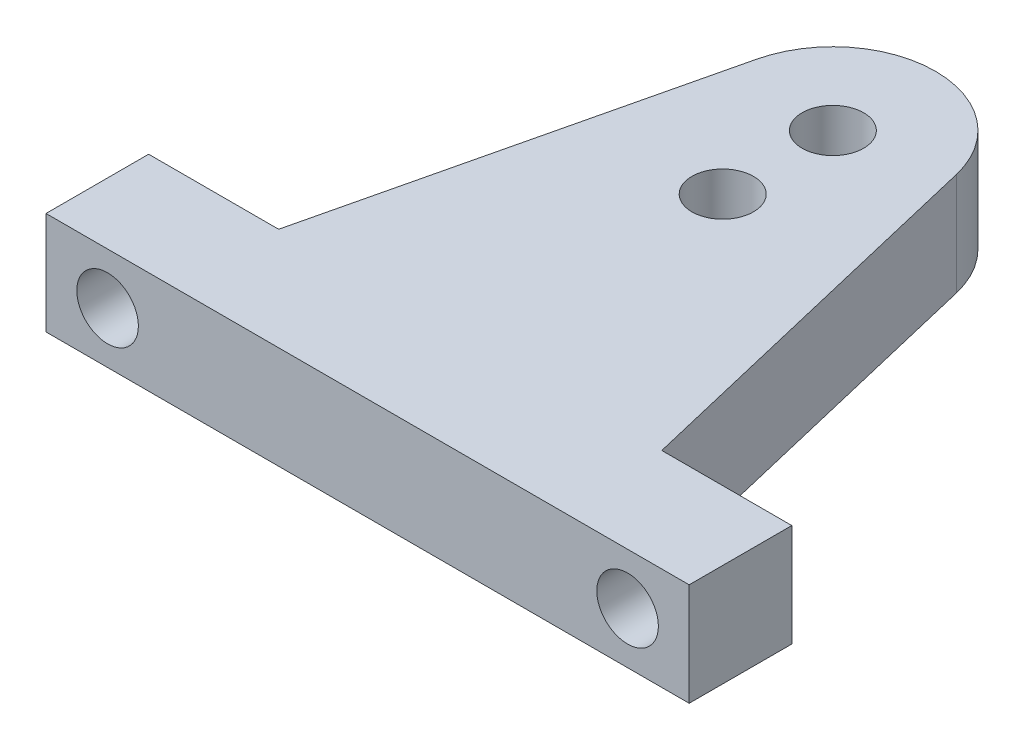
ISO-10303-21;
HEADER;
FILE_DESCRIPTION(('STEP AP214'),'2;1');
FILE_NAME('part.step','',(''),(''),'','','');
FILE_SCHEMA(('AUTOMOTIVE_DESIGN { 1 0 10303 214 1 1 1 1 }'));
ENDSEC;
DATA;
#1=APPLICATION_CONTEXT('core data for automotive mechanical design processes');
#2=APPLICATION_PROTOCOL_DEFINITION('international standard','automotive_design',2000,#1);
#3=PRODUCT_CONTEXT('',#1,'mechanical');
#4=PRODUCT('Part','Part','',(#3));
#5=PRODUCT_RELATED_PRODUCT_CATEGORY('part','',(#4));
#6=PRODUCT_DEFINITION_FORMATION('','',#4);
#7=PRODUCT_DEFINITION_CONTEXT('part definition',#1,'design');
#8=PRODUCT_DEFINITION('design','',#6,#7);
#9=PRODUCT_DEFINITION_SHAPE('','',#8);
#10=(LENGTH_UNIT() NAMED_UNIT(*) SI_UNIT(.MILLI.,.METRE.));
#11=(NAMED_UNIT(*) PLANE_ANGLE_UNIT() SI_UNIT($,.RADIAN.));
#12=(NAMED_UNIT(*) SI_UNIT($,.STERADIAN.) SOLID_ANGLE_UNIT());
#13=UNCERTAINTY_MEASURE_WITH_UNIT(LENGTH_MEASURE(1.E-05),#10,'distance_accuracy_value','');
#14=(GEOMETRIC_REPRESENTATION_CONTEXT(3) GLOBAL_UNCERTAINTY_ASSIGNED_CONTEXT((#13)) GLOBAL_UNIT_ASSIGNED_CONTEXT((#10,
#11,#12)) REPRESENTATION_CONTEXT('',''));
#15=CARTESIAN_POINT('',(0.,0.,0.));
#16=DIRECTION('',(0.,0.,1.));
#17=DIRECTION('',(1.,0.,0.));
#18=AXIS2_PLACEMENT_3D('',#15,#16,#17);
#19=CARTESIAN_POINT('',(47.,15.,0.));
#20=DIRECTION('',(-1.,0.,0.));
#21=DIRECTION('',(0.,0.,1.));
#22=AXIS2_PLACEMENT_3D('',#19,#20,#21);
#23=PLANE('',#22);
#24=DIRECTION('',(0.,0.,-1.));
#25=VECTOR('',#24,1.);
#26=CARTESIAN_POINT('',(47.,0.,0.));
#27=LINE('',#26,#25);
#28=CARTESIAN_POINT('',(47.,0.,0.));
#29=VERTEX_POINT('',#28);
#30=CARTESIAN_POINT('',(47.,0.,-15.));
#31=VERTEX_POINT('',#30);
#32=EDGE_CURVE('E129',#29,#31,#27,.T.);
#33=ORIENTED_EDGE('',*,*,#32,.T.);
#34=DIRECTION('',(0.,-1.,0.));
#35=VECTOR('',#34,1.);
#36=CARTESIAN_POINT('',(47.,15.,-15.));
#37=LINE('',#36,#35);
#38=CARTESIAN_POINT('',(47.,15.,-15.));
#39=VERTEX_POINT('',#38);
#40=EDGE_CURVE('E11',#39,#31,#37,.T.);
#41=ORIENTED_EDGE('',*,*,#40,.F.);
#42=DIRECTION('',(0.,0.,-1.));
#43=VECTOR('',#42,1.);
#44=CARTESIAN_POINT('',(47.,15.,0.));
#45=LINE('',#44,#43);
#46=CARTESIAN_POINT('',(47.,15.,0.));
#47=VERTEX_POINT('',#46);
#48=EDGE_CURVE('E144',#47,#39,#45,.T.);
#49=ORIENTED_EDGE('',*,*,#48,.F.);
#50=DIRECTION('',(0.,-1.,0.));
#51=VECTOR('',#50,1.);
#52=CARTESIAN_POINT('',(47.,15.,0.));
#53=LINE('',#52,#51);
#54=EDGE_CURVE('E125',#47,#29,#53,.T.);
#55=ORIENTED_EDGE('',*,*,#54,.T.);
#56=EDGE_LOOP('',(#33,#41,#49,#55));
#57=FACE_BOUND('',#56,.T.);
#58=ADVANCED_FACE('F33',(#57),#23,.F.);
#59=CARTESIAN_POINT('',(47.,15.,-15.));
#60=DIRECTION('',(0.,0.,1.));
#61=DIRECTION('',(1.,0.,0.));
#62=AXIS2_PLACEMENT_3D('',#59,#60,#61);
#63=PLANE('',#62);
#64=CARTESIAN_POINT('',(38.,7.5,-15.));
#65=DIRECTION('',(0.,0.,1.));
#66=DIRECTION('',(1.,0.,0.));
#67=AXIS2_PLACEMENT_3D('',#64,#65,#66);
#68=CIRCLE('',#67,4.5);
#69=CARTESIAN_POINT('',(42.5,7.5,-15.));
#70=VERTEX_POINT('',#69);
#71=EDGE_CURVE('E182',#70,#70,#68,.F.);
#72=ORIENTED_EDGE('',*,*,#71,.F.);
#73=EDGE_LOOP('',(#72));
#74=FACE_BOUND('',#73,.T.);
#75=DIRECTION('',(-1.,0.,0.));
#76=VECTOR('',#75,1.);
#77=CARTESIAN_POINT('',(47.,0.,-15.));
#78=LINE('',#77,#76);
#79=CARTESIAN_POINT('',(28.,0.,-15.));
#80=VERTEX_POINT('',#79);
#81=EDGE_CURVE('E132',#31,#80,#78,.T.);
#82=ORIENTED_EDGE('',*,*,#81,.T.);
#83=DIRECTION('',(0.,-1.,0.));
#84=VECTOR('',#83,1.);
#85=CARTESIAN_POINT('',(28.,15.,-15.));
#86=LINE('',#85,#84);
#87=CARTESIAN_POINT('',(28.,15.,-15.));
#88=VERTEX_POINT('',#87);
#89=EDGE_CURVE('E41',#88,#80,#86,.T.);
#90=ORIENTED_EDGE('',*,*,#89,.F.);
#91=DIRECTION('',(-1.,0.,0.));
#92=VECTOR('',#91,1.);
#93=CARTESIAN_POINT('',(47.,15.,-15.));
#94=LINE('',#93,#92);
#95=EDGE_CURVE('E92',#39,#88,#94,.T.);
#96=ORIENTED_EDGE('',*,*,#95,.F.);
#97=ORIENTED_EDGE('',*,*,#40,.T.);
#98=EDGE_LOOP('',(#82,#90,#96,#97));
#99=FACE_BOUND('',#98,.T.);
#100=ADVANCED_FACE('F229',(#74,#99),#63,.F.);
#101=CARTESIAN_POINT('',(14.5943238655105,15.,-71.4649258157414));
#102=DIRECTION('',(-0.972954924367366,0.,0.230995054382759));
#103=DIRECTION('',(0.230995054382759,0.,0.972954924367366));
#104=AXIS2_PLACEMENT_3D('',#101,#102,#103);
#105=PLANE('',#104);
#106=DIRECTION('',(-0.230995054382759,0.,-0.972954924367366));
#107=VECTOR('',#106,1.);
#108=CARTESIAN_POINT('',(14.5943238655105,0.,-71.4649258157414));
#109=LINE('',#108,#107);
#110=CARTESIAN_POINT('',(14.5943238655105,0.,-71.4649258157414));
#111=VERTEX_POINT('',#110);
#112=EDGE_CURVE('E135',#80,#111,#109,.T.);
#113=ORIENTED_EDGE('',*,*,#112,.T.);
#114=DIRECTION('',(0.,-1.,0.));
#115=VECTOR('',#114,1.);
#116=CARTESIAN_POINT('',(14.5943238655105,15.,-71.4649258157414));
#117=LINE('',#116,#115);
#118=CARTESIAN_POINT('',(14.5943238655105,15.,-71.4649258157414));
#119=VERTEX_POINT('',#118);
#120=EDGE_CURVE('E151',#119,#111,#117,.T.);
#121=ORIENTED_EDGE('',*,*,#120,.F.);
#122=DIRECTION('',(-0.230995054382759,0.,-0.972954924367366));
#123=VECTOR('',#122,1.);
#124=CARTESIAN_POINT('',(14.5943238655105,15.,-71.4649258157414));
#125=LINE('',#124,#123);
#126=EDGE_CURVE('E159',#88,#119,#125,.T.);
#127=ORIENTED_EDGE('',*,*,#126,.F.);
#128=ORIENTED_EDGE('',*,*,#89,.T.);
#129=EDGE_LOOP('',(#113,#121,#127,#128));
#130=FACE_BOUND('',#129,.T.);
#131=ADVANCED_FACE('F157',(#130),#105,.F.);
#132=CARTESIAN_POINT('',(0.,15.,-68.));
#133=DIRECTION('',(0.,-1.,0.));
#134=DIRECTION('',(0.,0.,-1.));
#135=AXIS2_PLACEMENT_3D('',#132,#133,#134);
#136=CYLINDRICAL_SURFACE('',#135,15.);
#137=CARTESIAN_POINT('',(0.,0.,-68.));
#138=DIRECTION('',(0.,1.,0.));
#139=DIRECTION('',(0.,0.,1.));
#140=AXIS2_PLACEMENT_3D('',#137,#138,#139);
#141=CIRCLE('',#140,15.);
#142=CARTESIAN_POINT('',(-14.5943238655105,0.,-71.4649258157414));
#143=VERTEX_POINT('',#142);
#144=EDGE_CURVE('E137',#111,#143,#141,.T.);
#145=ORIENTED_EDGE('',*,*,#144,.T.);
#146=DIRECTION('',(0.,-1.,0.));
#147=VECTOR('',#146,1.);
#148=CARTESIAN_POINT('',(-14.5943238655105,15.,-71.4649258157414));
#149=LINE('',#148,#147);
#150=CARTESIAN_POINT('',(-14.5943238655105,15.,-71.4649258157414));
#151=VERTEX_POINT('',#150);
#152=EDGE_CURVE('E148',#151,#143,#149,.T.);
#153=ORIENTED_EDGE('',*,*,#152,.F.);
#154=CARTESIAN_POINT('',(0.,15.,-68.));
#155=DIRECTION('',(0.,1.,0.));
#156=DIRECTION('',(0.,0.,1.));
#157=AXIS2_PLACEMENT_3D('',#154,#155,#156);
#158=CIRCLE('',#157,15.);
#159=EDGE_CURVE('E171',#119,#151,#158,.T.);
#160=ORIENTED_EDGE('',*,*,#159,.F.);
#161=ORIENTED_EDGE('',*,*,#120,.T.);
#162=EDGE_LOOP('',(#145,#153,#160,#161));
#163=FACE_BOUND('',#162,.T.);
#164=ADVANCED_FACE('F167',(#163),#136,.T.);
#165=CARTESIAN_POINT('',(-14.5943238655105,15.,-71.4649258157414));
#166=DIRECTION('',(0.972954924367366,0.,0.230995054382759));
#167=DIRECTION('',(0.230995054382759,0.,-0.972954924367366));
#168=AXIS2_PLACEMENT_3D('',#165,#166,#167);
#169=PLANE('',#168);
#170=DIRECTION('',(-0.230995054382759,0.,0.972954924367366));
#171=VECTOR('',#170,1.);
#172=CARTESIAN_POINT('',(-14.5943238655105,0.,-71.4649258157414));
#173=LINE('',#172,#171);
#174=CARTESIAN_POINT('',(-28.,0.,-15.));
#175=VERTEX_POINT('',#174);
#176=EDGE_CURVE('E139',#143,#175,#173,.T.);
#177=ORIENTED_EDGE('',*,*,#176,.T.);
#178=DIRECTION('',(0.,-1.,0.));
#179=VECTOR('',#178,1.);
#180=CARTESIAN_POINT('',(-28.,15.,-15.));
#181=LINE('',#180,#179);
#182=CARTESIAN_POINT('',(-28.,15.,-15.));
#183=VERTEX_POINT('',#182);
#184=EDGE_CURVE('E120',#183,#175,#181,.T.);
#185=ORIENTED_EDGE('',*,*,#184,.F.);
#186=DIRECTION('',(-0.230995054382759,0.,0.972954924367366));
#187=VECTOR('',#186,1.);
#188=CARTESIAN_POINT('',(-14.5943238655105,15.,-71.4649258157414));
#189=LINE('',#188,#187);
#190=EDGE_CURVE('E111',#151,#183,#189,.T.);
#191=ORIENTED_EDGE('',*,*,#190,.F.);
#192=ORIENTED_EDGE('',*,*,#152,.T.);
#193=EDGE_LOOP('',(#177,#185,#191,#192));
#194=FACE_BOUND('',#193,.T.);
#195=ADVANCED_FACE('F170',(#194),#169,.F.);
#196=CARTESIAN_POINT('',(-47.,15.,-15.));
#197=DIRECTION('',(0.,0.,1.));
#198=DIRECTION('',(1.,0.,0.));
#199=AXIS2_PLACEMENT_3D('',#196,#197,#198);
#200=PLANE('',#199);
#201=CARTESIAN_POINT('',(-38.,7.5,-15.));
#202=DIRECTION('',(0.,0.,1.));
#203=DIRECTION('',(1.,0.,0.));
#204=AXIS2_PLACEMENT_3D('',#201,#202,#203);
#205=CIRCLE('',#204,4.5);
#206=CARTESIAN_POINT('',(-33.5,7.5,-15.));
#207=VERTEX_POINT('',#206);
#208=EDGE_CURVE('E133',#207,#207,#205,.F.);
#209=ORIENTED_EDGE('',*,*,#208,.F.);
#210=EDGE_LOOP('',(#209));
#211=FACE_BOUND('',#210,.T.);
#212=DIRECTION('',(-1.,0.,0.));
#213=VECTOR('',#212,1.);
#214=CARTESIAN_POINT('',(-47.,0.,-15.));
#215=LINE('',#214,#213);
#216=CARTESIAN_POINT('',(-47.,0.,-15.));
#217=VERTEX_POINT('',#216);
#218=EDGE_CURVE('E119',#175,#217,#215,.T.);
#219=ORIENTED_EDGE('',*,*,#218,.T.);
#220=DIRECTION('',(0.,-1.,0.));
#221=VECTOR('',#220,1.);
#222=CARTESIAN_POINT('',(-47.,15.,-15.));
#223=LINE('',#222,#221);
#224=CARTESIAN_POINT('',(-47.,15.,-15.));
#225=VERTEX_POINT('',#224);
#226=EDGE_CURVE('E116',#225,#217,#223,.T.);
#227=ORIENTED_EDGE('',*,*,#226,.F.);
#228=DIRECTION('',(-1.,0.,0.));
#229=VECTOR('',#228,1.);
#230=CARTESIAN_POINT('',(-47.,15.,-15.));
#231=LINE('',#230,#229);
#232=EDGE_CURVE('E105',#183,#225,#231,.T.);
#233=ORIENTED_EDGE('',*,*,#232,.F.);
#234=ORIENTED_EDGE('',*,*,#184,.T.);
#235=EDGE_LOOP('',(#219,#227,#233,#234));
#236=FACE_BOUND('',#235,.T.);
#237=ADVANCED_FACE('F117',(#211,#236),#200,.F.);
#238=CARTESIAN_POINT('',(-47.,15.,0.));
#239=DIRECTION('',(1.,0.,0.));
#240=DIRECTION('',(0.,0.,-1.));
#241=AXIS2_PLACEMENT_3D('',#238,#239,#240);
#242=PLANE('',#241);
#243=DIRECTION('',(0.,0.,1.));
#244=VECTOR('',#243,1.);
#245=CARTESIAN_POINT('',(-47.,0.,0.));
#246=LINE('',#245,#244);
#247=CARTESIAN_POINT('',(-47.,0.,0.));
#248=VERTEX_POINT('',#247);
#249=EDGE_CURVE('E78',#217,#248,#246,.T.);
#250=ORIENTED_EDGE('',*,*,#249,.T.);
#251=DIRECTION('',(0.,-1.,0.));
#252=VECTOR('',#251,1.);
#253=CARTESIAN_POINT('',(-47.,15.,0.));
#254=LINE('',#253,#252);
#255=CARTESIAN_POINT('',(-47.,15.,0.));
#256=VERTEX_POINT('',#255);
#257=EDGE_CURVE('E121',#256,#248,#254,.T.);
#258=ORIENTED_EDGE('',*,*,#257,.F.);
#259=DIRECTION('',(0.,0.,1.));
#260=VECTOR('',#259,1.);
#261=CARTESIAN_POINT('',(-47.,15.,0.));
#262=LINE('',#261,#260);
#263=EDGE_CURVE('E109',#225,#256,#262,.T.);
#264=ORIENTED_EDGE('',*,*,#263,.F.);
#265=ORIENTED_EDGE('',*,*,#226,.T.);
#266=EDGE_LOOP('',(#250,#258,#264,#265));
#267=FACE_BOUND('',#266,.T.);
#268=ADVANCED_FACE('F123',(#267),#242,.F.);
#269=CARTESIAN_POINT('',(47.,15.,0.));
#270=DIRECTION('',(0.,0.,-1.));
#271=DIRECTION('',(-1.,0.,0.));
#272=AXIS2_PLACEMENT_3D('',#269,#270,#271);
#273=PLANE('',#272);
#274=CARTESIAN_POINT('',(38.,7.5,0.));
#275=DIRECTION('',(0.,0.,1.));
#276=DIRECTION('',(1.,0.,0.));
#277=AXIS2_PLACEMENT_3D('',#274,#275,#276);
#278=CIRCLE('',#277,4.5);
#279=CARTESIAN_POINT('',(42.5,7.5,0.));
#280=VERTEX_POINT('',#279);
#281=EDGE_CURVE('E185',#280,#280,#278,.T.);
#282=ORIENTED_EDGE('',*,*,#281,.F.);
#283=EDGE_LOOP('',(#282));
#284=FACE_BOUND('',#283,.T.);
#285=CARTESIAN_POINT('',(-38.,7.5,0.));
#286=DIRECTION('',(0.,0.,1.));
#287=DIRECTION('',(1.,0.,0.));
#288=AXIS2_PLACEMENT_3D('',#285,#286,#287);
#289=CIRCLE('',#288,4.5);
#290=CARTESIAN_POINT('',(-33.5,7.5,0.));
#291=VERTEX_POINT('',#290);
#292=EDGE_CURVE('E179',#291,#291,#289,.T.);
#293=ORIENTED_EDGE('',*,*,#292,.F.);
#294=EDGE_LOOP('',(#293));
#295=FACE_BOUND('',#294,.T.);
#296=DIRECTION('',(1.,0.,0.));
#297=VECTOR('',#296,1.);
#298=CARTESIAN_POINT('',(47.,0.,0.));
#299=LINE('',#298,#297);
#300=EDGE_CURVE('E84',#248,#29,#299,.T.);
#301=ORIENTED_EDGE('',*,*,#300,.T.);
#302=ORIENTED_EDGE('',*,*,#54,.F.);
#303=DIRECTION('',(1.,0.,0.));
#304=VECTOR('',#303,1.);
#305=CARTESIAN_POINT('',(47.,15.,0.));
#306=LINE('',#305,#304);
#307=EDGE_CURVE('E49',#256,#47,#306,.T.);
#308=ORIENTED_EDGE('',*,*,#307,.F.);
#309=ORIENTED_EDGE('',*,*,#257,.T.);
#310=EDGE_LOOP('',(#301,#302,#308,#309));
#311=FACE_BOUND('',#310,.T.);
#312=ADVANCED_FACE('F206',(#284,#295,#311),#273,.F.);
#313=CARTESIAN_POINT('',(0.,15.,-68.));
#314=DIRECTION('',(0.,1.,0.));
#315=DIRECTION('',(0.,0.,1.));
#316=AXIS2_PLACEMENT_3D('',#313,#314,#315);
#317=PLANE('',#316);
#318=CARTESIAN_POINT('',(0.,15.,-51.9));
#319=DIRECTION('',(0.,1.,0.));
#320=DIRECTION('',(0.,0.,1.));
#321=AXIS2_PLACEMENT_3D('',#318,#319,#320);
#322=CIRCLE('',#321,4.5);
#323=CARTESIAN_POINT('',(0.,15.,-47.4));
#324=VERTEX_POINT('',#323);
#325=EDGE_CURVE('E197',#324,#324,#322,.T.);
#326=ORIENTED_EDGE('',*,*,#325,.F.);
#327=EDGE_LOOP('',(#326));
#328=FACE_BOUND('',#327,.T.);
#329=CARTESIAN_POINT('',(0.,15.,-68.));
#330=DIRECTION('',(0.,1.,0.));
#331=DIRECTION('',(0.,0.,1.));
#332=AXIS2_PLACEMENT_3D('',#329,#330,#331);
#333=CIRCLE('',#332,4.5);
#334=CARTESIAN_POINT('',(0.,15.,-63.5));
#335=VERTEX_POINT('',#334);
#336=EDGE_CURVE('E191',#335,#335,#333,.T.);
#337=ORIENTED_EDGE('',*,*,#336,.F.);
#338=EDGE_LOOP('',(#337));
#339=FACE_BOUND('',#338,.T.);
#340=ORIENTED_EDGE('',*,*,#48,.T.);
#341=ORIENTED_EDGE('',*,*,#95,.T.);
#342=ORIENTED_EDGE('',*,*,#126,.T.);
#343=ORIENTED_EDGE('',*,*,#159,.T.);
#344=ORIENTED_EDGE('',*,*,#190,.T.);
#345=ORIENTED_EDGE('',*,*,#232,.T.);
#346=ORIENTED_EDGE('',*,*,#263,.T.);
#347=ORIENTED_EDGE('',*,*,#307,.T.);
#348=EDGE_LOOP('',(#340,#341,#342,#343,#344,#345,#346,#347));
#349=FACE_BOUND('',#348,.T.);
#350=ADVANCED_FACE('F107',(#328,#339,#349),#317,.T.);
#351=CARTESIAN_POINT('',(0.,0.,-68.));
#352=DIRECTION('',(0.,1.,0.));
#353=DIRECTION('',(0.,0.,1.));
#354=AXIS2_PLACEMENT_3D('',#351,#352,#353);
#355=PLANE('',#354);
#356=CARTESIAN_POINT('',(0.,0.,-51.9));
#357=DIRECTION('',(0.,1.,0.));
#358=DIRECTION('',(0.,0.,1.));
#359=AXIS2_PLACEMENT_3D('',#356,#357,#358);
#360=CIRCLE('',#359,4.5);
#361=CARTESIAN_POINT('',(0.,0.,-47.4));
#362=VERTEX_POINT('',#361);
#363=EDGE_CURVE('E194',#362,#362,#360,.F.);
#364=ORIENTED_EDGE('',*,*,#363,.F.);
#365=EDGE_LOOP('',(#364));
#366=FACE_BOUND('',#365,.T.);
#367=CARTESIAN_POINT('',(0.,0.,-68.));
#368=DIRECTION('',(0.,1.,0.));
#369=DIRECTION('',(0.,0.,1.));
#370=AXIS2_PLACEMENT_3D('',#367,#368,#369);
#371=CIRCLE('',#370,4.5);
#372=CARTESIAN_POINT('',(0.,0.,-63.5));
#373=VERTEX_POINT('',#372);
#374=EDGE_CURVE('E188',#373,#373,#371,.F.);
#375=ORIENTED_EDGE('',*,*,#374,.F.);
#376=EDGE_LOOP('',(#375));
#377=FACE_BOUND('',#376,.T.);
#378=ORIENTED_EDGE('',*,*,#32,.F.);
#379=ORIENTED_EDGE('',*,*,#300,.F.);
#380=ORIENTED_EDGE('',*,*,#249,.F.);
#381=ORIENTED_EDGE('',*,*,#218,.F.);
#382=ORIENTED_EDGE('',*,*,#176,.F.);
#383=ORIENTED_EDGE('',*,*,#144,.F.);
#384=ORIENTED_EDGE('',*,*,#112,.F.);
#385=ORIENTED_EDGE('',*,*,#81,.F.);
#386=EDGE_LOOP('',(#378,#379,#380,#381,#382,#383,#384,#385));
#387=FACE_BOUND('',#386,.T.);
#388=ADVANCED_FACE('F163',(#366,#377,#387),#355,.F.);
#389=CARTESIAN_POINT('',(-38.,7.5,-83.001));
#390=DIRECTION('',(0.,0.,1.));
#391=DIRECTION('',(1.,0.,0.));
#392=AXIS2_PLACEMENT_3D('',#389,#390,#391);
#393=CYLINDRICAL_SURFACE('',#392,4.5);
#394=ORIENTED_EDGE('',*,*,#292,.T.);
#395=EDGE_LOOP('',(#394));
#396=FACE_BOUND('',#395,.T.);
#397=ORIENTED_EDGE('',*,*,#208,.T.);
#398=EDGE_LOOP('',(#397));
#399=FACE_BOUND('',#398,.T.);
#400=ADVANCED_FACE('F218',(#396,#399),#393,.F.);
#401=CARTESIAN_POINT('',(38.,7.5,-83.001));
#402=DIRECTION('',(0.,0.,1.));
#403=DIRECTION('',(1.,0.,0.));
#404=AXIS2_PLACEMENT_3D('',#401,#402,#403);
#405=CYLINDRICAL_SURFACE('',#404,4.5);
#406=ORIENTED_EDGE('',*,*,#281,.T.);
#407=EDGE_LOOP('',(#406));
#408=FACE_BOUND('',#407,.T.);
#409=ORIENTED_EDGE('',*,*,#71,.T.);
#410=EDGE_LOOP('',(#409));
#411=FACE_BOUND('',#410,.T.);
#412=ADVANCED_FACE('F213',(#408,#411),#405,.F.);
#413=CARTESIAN_POINT('',(0.,-0.000999999999999265,-68.));
#414=DIRECTION('',(0.,1.,0.));
#415=DIRECTION('',(0.,0.,1.));
#416=AXIS2_PLACEMENT_3D('',#413,#414,#415);
#417=CYLINDRICAL_SURFACE('',#416,4.5);
#418=CARTESIAN_POINT('',(0.,15.,-63.5));
#419=CARTESIAN_POINT('',(0.,14.84375,-63.5));
#420=CARTESIAN_POINT('',(0.,14.6875,-63.5));
#421=CARTESIAN_POINT('',(0.,14.375,-63.5));
#422=CARTESIAN_POINT('',(0.,14.21875,-63.5));
#423=CARTESIAN_POINT('',(0.,13.90625,-63.5));
#424=CARTESIAN_POINT('',(0.,13.75,-63.5));
#425=CARTESIAN_POINT('',(0.,13.4375,-63.5));
#426=CARTESIAN_POINT('',(0.,13.28125,-63.5));
#427=CARTESIAN_POINT('',(0.,12.96875,-63.5));
#428=CARTESIAN_POINT('',(0.,12.8125,-63.5));
#429=CARTESIAN_POINT('',(0.,12.5,-63.5));
#430=CARTESIAN_POINT('',(0.,12.34375,-63.5));
#431=CARTESIAN_POINT('',(0.,12.03125,-63.5));
#432=CARTESIAN_POINT('',(0.,11.875,-63.5));
#433=CARTESIAN_POINT('',(0.,11.5625,-63.5));
#434=CARTESIAN_POINT('',(0.,11.40625,-63.5));
#435=CARTESIAN_POINT('',(0.,11.09375,-63.5));
#436=CARTESIAN_POINT('',(0.,10.9375,-63.5));
#437=CARTESIAN_POINT('',(0.,10.625,-63.5));
#438=CARTESIAN_POINT('',(0.,10.46875,-63.5));
#439=CARTESIAN_POINT('',(0.,10.15625,-63.5));
#440=CARTESIAN_POINT('',(0.,10.,-63.5));
#441=CARTESIAN_POINT('',(0.,9.6875,-63.5));
#442=CARTESIAN_POINT('',(0.,9.53125,-63.5));
#443=CARTESIAN_POINT('',(0.,9.21875,-63.5));
#444=CARTESIAN_POINT('',(0.,9.0625,-63.5));
#445=CARTESIAN_POINT('',(0.,8.75,-63.5));
#446=CARTESIAN_POINT('',(0.,8.59375,-63.5));
#447=CARTESIAN_POINT('',(0.,8.28125,-63.5));
#448=CARTESIAN_POINT('',(0.,8.125,-63.5));
#449=CARTESIAN_POINT('',(0.,7.8125,-63.5));
#450=CARTESIAN_POINT('',(0.,7.65625,-63.5));
#451=CARTESIAN_POINT('',(0.,7.34375,-63.5));
#452=CARTESIAN_POINT('',(0.,7.1875,-63.5));
#453=CARTESIAN_POINT('',(0.,6.875,-63.5));
#454=CARTESIAN_POINT('',(0.,6.71875,-63.5));
#455=CARTESIAN_POINT('',(0.,6.40625,-63.5));
#456=CARTESIAN_POINT('',(0.,6.25,-63.5));
#457=CARTESIAN_POINT('',(0.,5.9375,-63.5));
#458=CARTESIAN_POINT('',(0.,5.78125,-63.5));
#459=CARTESIAN_POINT('',(0.,5.46875,-63.5));
#460=CARTESIAN_POINT('',(0.,5.3125,-63.5));
#461=CARTESIAN_POINT('',(0.,5.,-63.5));
#462=CARTESIAN_POINT('',(0.,4.84375,-63.5));
#463=CARTESIAN_POINT('',(0.,4.53125,-63.5));
#464=CARTESIAN_POINT('',(0.,4.375,-63.5));
#465=CARTESIAN_POINT('',(0.,4.0625,-63.5));
#466=CARTESIAN_POINT('',(0.,3.90625,-63.5));
#467=CARTESIAN_POINT('',(0.,3.59375,-63.5));
#468=CARTESIAN_POINT('',(0.,3.4375,-63.5));
#469=CARTESIAN_POINT('',(0.,3.125,-63.5));
#470=CARTESIAN_POINT('',(0.,2.96875,-63.5));
#471=CARTESIAN_POINT('',(0.,2.65625,-63.5));
#472=CARTESIAN_POINT('',(0.,2.5,-63.5));
#473=CARTESIAN_POINT('',(0.,2.1875,-63.5));
#474=CARTESIAN_POINT('',(0.,2.03125,-63.5));
#475=CARTESIAN_POINT('',(0.,1.71875,-63.5));
#476=CARTESIAN_POINT('',(0.,1.5625,-63.5));
#477=CARTESIAN_POINT('',(0.,1.25,-63.5));
#478=CARTESIAN_POINT('',(0.,1.09375,-63.5));
#479=CARTESIAN_POINT('',(0.,0.781250000000001,-63.5));
#480=CARTESIAN_POINT('',(0.,0.625,-63.5));
#481=CARTESIAN_POINT('',(0.,0.3125,-63.5));
#482=CARTESIAN_POINT('',(0.,0.15625,-63.5));
#483=CARTESIAN_POINT('',(0.,0.,-63.5));
#484=B_SPLINE_CURVE_WITH_KNOTS('',3,(#418,#419,#420,#421,#422,#423,#424,#425,#426,#427,#428,
#429,#430,#431,#432,#433,#434,#435,#436,#437,#438,#439,#440,#441,#442,#443,#444,#445,#446,#447,
#448,#449,#450,#451,#452,#453,#454,#455,#456,#457,#458,#459,#460,#461,#462,#463,#464,#465,#466,
#467,#468,#469,#470,#471,#472,#473,#474,#475,#476,#477,#478,#479,#480,#481,#482,#483),
.UNSPECIFIED.,.F.,.F.,(4,2,2,2,2,2,2,2,2,2,2,2,2,2,2,2,2,2,2,2,2,2,2,2,2,2,2,2,2,2,2,2,4),(0.,
0.46875,0.937500000000001,1.40625,1.875,2.34375,2.8125,3.28125,3.75,4.21875,4.6875,5.15625,
5.625,6.09375,6.5625,7.03125,7.5,7.96875,8.4375,8.90625,9.375,9.84375,10.3125,10.78125,11.25,
11.71875,12.1875,12.65625,13.125,13.59375,14.0625,14.53125,15.),.UNSPECIFIED.);
#485=EDGE_CURVE('BSEAM210',#335,#373,#484,.T.);
#486=ORIENTED_EDGE('',*,*,#336,.T.);
#487=ORIENTED_EDGE('',*,*,#374,.T.);
#488=ORIENTED_EDGE('',*,*,#485,.T.);
#489=ORIENTED_EDGE('',*,*,#485,.F.);
#490=EDGE_LOOP('',(#486,#488,#487,#489));
#491=FACE_BOUND('',#490,.T.);
#492=ADVANCED_FACE('F210',(#491),#417,.F.);
#493=CARTESIAN_POINT('',(0.,-0.000999999999999265,-51.9));
#494=DIRECTION('',(0.,1.,0.));
#495=DIRECTION('',(0.,0.,1.));
#496=AXIS2_PLACEMENT_3D('',#493,#494,#495);
#497=CYLINDRICAL_SURFACE('',#496,4.5);
#498=CARTESIAN_POINT('',(0.,15.,-47.4));
#499=CARTESIAN_POINT('',(0.,14.84375,-47.4));
#500=CARTESIAN_POINT('',(0.,14.6875,-47.4));
#501=CARTESIAN_POINT('',(0.,14.375,-47.4));
#502=CARTESIAN_POINT('',(0.,14.21875,-47.4));
#503=CARTESIAN_POINT('',(0.,13.90625,-47.4));
#504=CARTESIAN_POINT('',(0.,13.75,-47.4));
#505=CARTESIAN_POINT('',(0.,13.4375,-47.4));
#506=CARTESIAN_POINT('',(0.,13.28125,-47.4));
#507=CARTESIAN_POINT('',(0.,12.96875,-47.4));
#508=CARTESIAN_POINT('',(0.,12.8125,-47.4));
#509=CARTESIAN_POINT('',(0.,12.5,-47.4));
#510=CARTESIAN_POINT('',(0.,12.34375,-47.4));
#511=CARTESIAN_POINT('',(0.,12.03125,-47.4));
#512=CARTESIAN_POINT('',(0.,11.875,-47.4));
#513=CARTESIAN_POINT('',(0.,11.5625,-47.4));
#514=CARTESIAN_POINT('',(0.,11.40625,-47.4));
#515=CARTESIAN_POINT('',(0.,11.09375,-47.4));
#516=CARTESIAN_POINT('',(0.,10.9375,-47.4));
#517=CARTESIAN_POINT('',(0.,10.625,-47.4));
#518=CARTESIAN_POINT('',(0.,10.46875,-47.4));
#519=CARTESIAN_POINT('',(0.,10.15625,-47.4));
#520=CARTESIAN_POINT('',(0.,10.,-47.4));
#521=CARTESIAN_POINT('',(0.,9.6875,-47.4));
#522=CARTESIAN_POINT('',(0.,9.53125,-47.4));
#523=CARTESIAN_POINT('',(0.,9.21875,-47.4));
#524=CARTESIAN_POINT('',(0.,9.0625,-47.4));
#525=CARTESIAN_POINT('',(0.,8.75,-47.4));
#526=CARTESIAN_POINT('',(0.,8.59375,-47.4));
#527=CARTESIAN_POINT('',(0.,8.28125,-47.4));
#528=CARTESIAN_POINT('',(0.,8.125,-47.4));
#529=CARTESIAN_POINT('',(0.,7.8125,-47.4));
#530=CARTESIAN_POINT('',(0.,7.65625,-47.4));
#531=CARTESIAN_POINT('',(0.,7.34375,-47.4));
#532=CARTESIAN_POINT('',(0.,7.1875,-47.4));
#533=CARTESIAN_POINT('',(0.,6.875,-47.4));
#534=CARTESIAN_POINT('',(0.,6.71875,-47.4));
#535=CARTESIAN_POINT('',(0.,6.40625,-47.4));
#536=CARTESIAN_POINT('',(0.,6.25,-47.4));
#537=CARTESIAN_POINT('',(0.,5.9375,-47.4));
#538=CARTESIAN_POINT('',(0.,5.78125,-47.4));
#539=CARTESIAN_POINT('',(0.,5.46875,-47.4));
#540=CARTESIAN_POINT('',(0.,5.3125,-47.4));
#541=CARTESIAN_POINT('',(0.,5.,-47.4));
#542=CARTESIAN_POINT('',(0.,4.84375,-47.4));
#543=CARTESIAN_POINT('',(0.,4.53125,-47.4));
#544=CARTESIAN_POINT('',(0.,4.375,-47.4));
#545=CARTESIAN_POINT('',(0.,4.0625,-47.4));
#546=CARTESIAN_POINT('',(0.,3.90625,-47.4));
#547=CARTESIAN_POINT('',(0.,3.59375,-47.4));
#548=CARTESIAN_POINT('',(0.,3.4375,-47.4));
#549=CARTESIAN_POINT('',(0.,3.125,-47.4));
#550=CARTESIAN_POINT('',(0.,2.96875,-47.4));
#551=CARTESIAN_POINT('',(0.,2.65625,-47.4));
#552=CARTESIAN_POINT('',(0.,2.5,-47.4));
#553=CARTESIAN_POINT('',(0.,2.1875,-47.4));
#554=CARTESIAN_POINT('',(0.,2.03125,-47.4));
#555=CARTESIAN_POINT('',(0.,1.71875,-47.4));
#556=CARTESIAN_POINT('',(0.,1.5625,-47.4));
#557=CARTESIAN_POINT('',(0.,1.25,-47.4));
#558=CARTESIAN_POINT('',(0.,1.09375,-47.4));
#559=CARTESIAN_POINT('',(0.,0.781250000000001,-47.4));
#560=CARTESIAN_POINT('',(0.,0.625,-47.4));
#561=CARTESIAN_POINT('',(0.,0.3125,-47.4));
#562=CARTESIAN_POINT('',(0.,0.15625,-47.4));
#563=CARTESIAN_POINT('',(0.,0.,-47.4));
#564=B_SPLINE_CURVE_WITH_KNOTS('',3,(#498,#499,#500,#501,#502,#503,#504,#505,#506,#507,#508,
#509,#510,#511,#512,#513,#514,#515,#516,#517,#518,#519,#520,#521,#522,#523,#524,#525,#526,#527,
#528,#529,#530,#531,#532,#533,#534,#535,#536,#537,#538,#539,#540,#541,#542,#543,#544,#545,#546,
#547,#548,#549,#550,#551,#552,#553,#554,#555,#556,#557,#558,#559,#560,#561,#562,#563),
.UNSPECIFIED.,.F.,.F.,(4,2,2,2,2,2,2,2,2,2,2,2,2,2,2,2,2,2,2,2,2,2,2,2,2,2,2,2,2,2,2,2,4),(0.,
0.46875,0.937500000000001,1.40625,1.875,2.34375,2.8125,3.28125,3.75,4.21875,4.6875,5.15625,
5.625,6.09375,6.5625,7.03125,7.5,7.96875,8.4375,8.90625,9.375,9.84375,10.3125,10.78125,11.25,
11.71875,12.1875,12.65625,13.125,13.59375,14.0625,14.53125,15.),.UNSPECIFIED.);
#565=EDGE_CURVE('BSEAM201',#324,#362,#564,.T.);
#566=ORIENTED_EDGE('',*,*,#325,.T.);
#567=ORIENTED_EDGE('',*,*,#363,.T.);
#568=ORIENTED_EDGE('',*,*,#565,.T.);
#569=ORIENTED_EDGE('',*,*,#565,.F.);
#570=EDGE_LOOP('',(#566,#568,#567,#569));
#571=FACE_BOUND('',#570,.T.);
#572=ADVANCED_FACE('F201',(#571),#497,.F.);
#573=CLOSED_SHELL('',(#58,#100,#131,#164,#195,#237,#268,#312,#350,#388,#400,#412,#492,#572));
#574=MANIFOLD_SOLID_BREP('B2',#573);
#575=ADVANCED_BREP_SHAPE_REPRESENTATION('',(#18,#574),#14);
#576=SHAPE_DEFINITION_REPRESENTATION(#9,#575);
ENDSEC;
END-ISO-10303-21;
